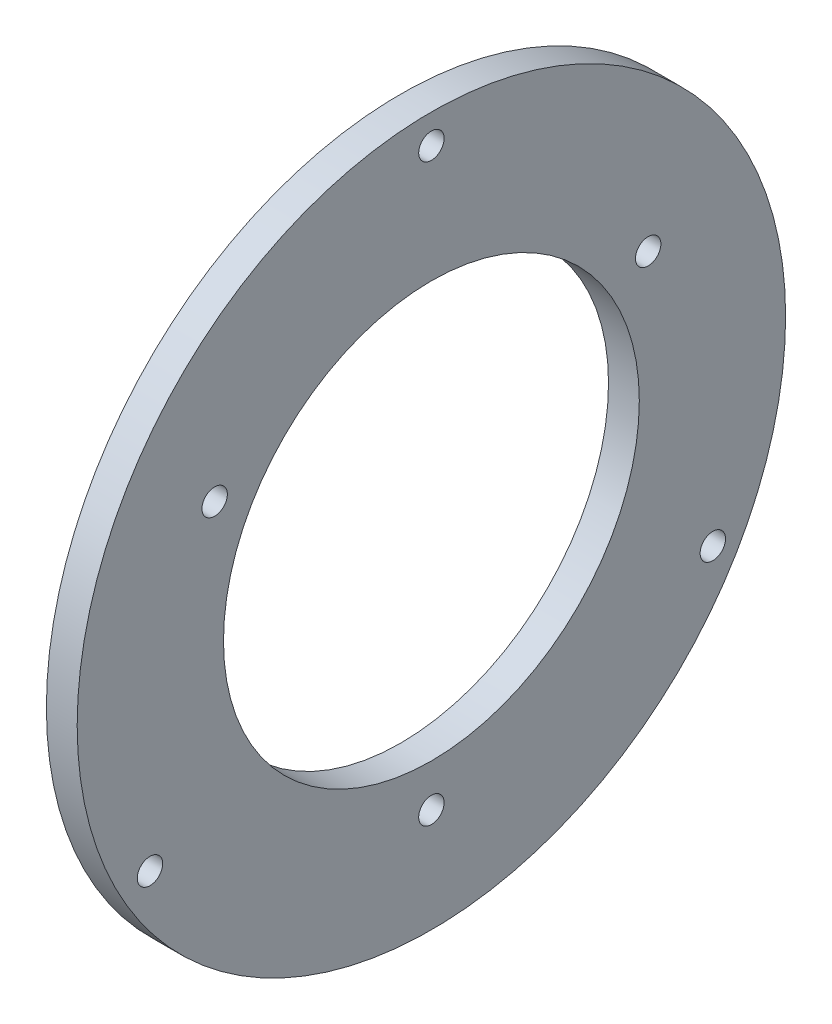
ISO-10303-21;
HEADER;
FILE_DESCRIPTION(('STEP AP214'),'2;1');
FILE_NAME('part.step','',(''),(''),'','','');
FILE_SCHEMA(('AUTOMOTIVE_DESIGN { 1 0 10303 214 1 1 1 1 }'));
ENDSEC;
DATA;
#1=APPLICATION_CONTEXT('core data for automotive mechanical design processes');
#2=APPLICATION_PROTOCOL_DEFINITION('international standard','automotive_design',2000,#1);
#3=PRODUCT_CONTEXT('',#1,'mechanical');
#4=PRODUCT('Part','Part','',(#3));
#5=PRODUCT_RELATED_PRODUCT_CATEGORY('part','',(#4));
#6=PRODUCT_DEFINITION_FORMATION('','',#4);
#7=PRODUCT_DEFINITION_CONTEXT('part definition',#1,'design');
#8=PRODUCT_DEFINITION('design','',#6,#7);
#9=PRODUCT_DEFINITION_SHAPE('','',#8);
#10=(LENGTH_UNIT() NAMED_UNIT(*) SI_UNIT(.MILLI.,.METRE.));
#11=(NAMED_UNIT(*) PLANE_ANGLE_UNIT() SI_UNIT($,.RADIAN.));
#12=(NAMED_UNIT(*) SI_UNIT($,.STERADIAN.) SOLID_ANGLE_UNIT());
#13=UNCERTAINTY_MEASURE_WITH_UNIT(LENGTH_MEASURE(1.E-05),#10,'distance_accuracy_value','');
#14=(GEOMETRIC_REPRESENTATION_CONTEXT(3) GLOBAL_UNCERTAINTY_ASSIGNED_CONTEXT((#13)) GLOBAL_UNIT_ASSIGNED_CONTEXT((#10,
#11,#12)) REPRESENTATION_CONTEXT('',''));
#15=CARTESIAN_POINT('',(0.,0.,0.));
#16=DIRECTION('',(0.,0.,1.));
#17=DIRECTION('',(1.,0.,0.));
#18=AXIS2_PLACEMENT_3D('',#15,#16,#17);
#19=CARTESIAN_POINT('',(131.7,46.,0.));
#20=DIRECTION('',(1.,0.,0.));
#21=DIRECTION('',(0.,0.,-1.));
#22=AXIS2_PLACEMENT_3D('',#19,#20,#21);
#23=PLANE('',#22);
#24=CARTESIAN_POINT('',(131.7,42.2,0.));
#25=DIRECTION('',(1.,0.,0.));
#26=DIRECTION('',(0.,0.,-1.));
#27=AXIS2_PLACEMENT_3D('',#24,#25,#26);
#28=CIRCLE('',#27,1.65);
#29=CARTESIAN_POINT('',(131.7,42.2,-1.65));
#30=VERTEX_POINT('',#29);
#31=EDGE_CURVE('E50',#30,#30,#28,.F.);
#32=ORIENTED_EDGE('',*,*,#31,.F.);
#33=EDGE_LOOP('',(#32));
#34=FACE_BOUND('',#33,.T.);
#35=CARTESIAN_POINT('',(131.7,16.25,-28.1458256229943));
#36=DIRECTION('',(1.,0.,0.));
#37=DIRECTION('',(0.,0.,-1.));
#38=AXIS2_PLACEMENT_3D('',#35,#36,#37);
#39=CIRCLE('',#38,1.65);
#40=CARTESIAN_POINT('',(131.7,16.25,-29.7958256229943));
#41=VERTEX_POINT('',#40);
#42=EDGE_CURVE('E53',#41,#41,#39,.F.);
#43=ORIENTED_EDGE('',*,*,#42,.F.);
#44=EDGE_LOOP('',(#43));
#45=FACE_BOUND('',#44,.T.);
#46=CARTESIAN_POINT('',(131.7,-21.1,36.5462720397033));
#47=DIRECTION('',(1.,0.,0.));
#48=DIRECTION('',(0.,0.,-1.));
#49=AXIS2_PLACEMENT_3D('',#46,#47,#48);
#50=CIRCLE('',#49,1.65);
#51=CARTESIAN_POINT('',(131.7,-21.1,34.8962720397033));
#52=VERTEX_POINT('',#51);
#53=EDGE_CURVE('E56',#52,#52,#50,.F.);
#54=ORIENTED_EDGE('',*,*,#53,.F.);
#55=EDGE_LOOP('',(#54));
#56=FACE_BOUND('',#55,.T.);
#57=CARTESIAN_POINT('',(131.7,-21.1,-36.5462720397033));
#58=DIRECTION('',(1.,0.,0.));
#59=DIRECTION('',(0.,0.,-1.));
#60=AXIS2_PLACEMENT_3D('',#57,#58,#59);
#61=CIRCLE('',#60,1.65);
#62=CARTESIAN_POINT('',(131.7,-21.1,-38.1962720397033));
#63=VERTEX_POINT('',#62);
#64=EDGE_CURVE('E59',#63,#63,#61,.F.);
#65=ORIENTED_EDGE('',*,*,#64,.F.);
#66=EDGE_LOOP('',(#65));
#67=FACE_BOUND('',#66,.T.);
#68=CARTESIAN_POINT('',(131.7,16.25,28.1458256229943));
#69=DIRECTION('',(1.,0.,0.));
#70=DIRECTION('',(0.,0.,-1.));
#71=AXIS2_PLACEMENT_3D('',#68,#69,#70);
#72=CIRCLE('',#71,1.65);
#73=CARTESIAN_POINT('',(131.7,16.25,26.4958256229943));
#74=VERTEX_POINT('',#73);
#75=EDGE_CURVE('E62',#74,#74,#72,.F.);
#76=ORIENTED_EDGE('',*,*,#75,.F.);
#77=EDGE_LOOP('',(#76));
#78=FACE_BOUND('',#77,.T.);
#79=CARTESIAN_POINT('',(131.7,-32.5,0.));
#80=DIRECTION('',(1.,0.,0.));
#81=DIRECTION('',(0.,0.,-1.));
#82=AXIS2_PLACEMENT_3D('',#79,#80,#81);
#83=CIRCLE('',#82,1.65);
#84=CARTESIAN_POINT('',(131.7,-32.5,-1.65));
#85=VERTEX_POINT('',#84);
#86=EDGE_CURVE('E65',#85,#85,#83,.F.);
#87=ORIENTED_EDGE('',*,*,#86,.F.);
#88=EDGE_LOOP('',(#87));
#89=FACE_BOUND('',#88,.T.);
#90=CARTESIAN_POINT('',(131.7,0.,0.));
#91=DIRECTION('',(-1.,0.,0.));
#92=DIRECTION('',(0.,0.,1.));
#93=AXIS2_PLACEMENT_3D('',#90,#91,#92);
#94=CIRCLE('',#93,27.);
#95=CARTESIAN_POINT('',(131.7,0.,27.));
#96=VERTEX_POINT('',#95);
#97=EDGE_CURVE('E10',#96,#96,#94,.T.);
#98=ORIENTED_EDGE('',*,*,#97,.F.);
#99=EDGE_LOOP('',(#98));
#100=FACE_BOUND('',#99,.T.);
#101=CARTESIAN_POINT('',(131.7,0.,0.));
#102=DIRECTION('',(-1.,0.,0.));
#103=DIRECTION('',(0.,0.,1.));
#104=AXIS2_PLACEMENT_3D('',#101,#102,#103);
#105=CIRCLE('',#104,46.);
#106=CARTESIAN_POINT('',(131.7,0.,46.));
#107=VERTEX_POINT('',#106);
#108=EDGE_CURVE('E45',#107,#107,#105,.T.);
#109=ORIENTED_EDGE('',*,*,#108,.T.);
#110=EDGE_LOOP('',(#109));
#111=FACE_BOUND('',#110,.T.);
#112=ADVANCED_FACE('F31',(#34,#45,#56,#67,#78,#89,#100,#111),#23,.F.);
#113=CARTESIAN_POINT('',(-110.,0.,0.));
#114=DIRECTION('',(-1.,0.,0.));
#115=DIRECTION('',(0.,0.,1.));
#116=AXIS2_PLACEMENT_3D('',#113,#114,#115);
#117=CYLINDRICAL_SURFACE('',#116,27.);
#118=CARTESIAN_POINT('',(135.7,0.,0.));
#119=DIRECTION('',(-1.,0.,0.));
#120=DIRECTION('',(0.,0.,1.));
#121=AXIS2_PLACEMENT_3D('',#118,#119,#120);
#122=CIRCLE('',#121,27.);
#123=CARTESIAN_POINT('',(135.7,0.,27.));
#124=VERTEX_POINT('',#123);
#125=EDGE_CURVE('E37',#124,#124,#122,.T.);
#126=ORIENTED_EDGE('',*,*,#125,.F.);
#127=EDGE_LOOP('',(#126));
#128=FACE_BOUND('',#127,.T.);
#129=ORIENTED_EDGE('',*,*,#97,.T.);
#130=EDGE_LOOP('',(#129));
#131=FACE_BOUND('',#130,.T.);
#132=ADVANCED_FACE('F94',(#128,#131),#117,.F.);
#133=CARTESIAN_POINT('',(135.7,27.,0.));
#134=DIRECTION('',(-1.,0.,0.));
#135=DIRECTION('',(0.,0.,1.));
#136=AXIS2_PLACEMENT_3D('',#133,#134,#135);
#137=PLANE('',#136);
#138=CARTESIAN_POINT('',(135.7,42.2,0.));
#139=DIRECTION('',(1.,0.,0.));
#140=DIRECTION('',(0.,0.,-1.));
#141=AXIS2_PLACEMENT_3D('',#138,#139,#140);
#142=CIRCLE('',#141,1.65);
#143=CARTESIAN_POINT('',(135.7,42.2,-1.65));
#144=VERTEX_POINT('',#143);
#145=EDGE_CURVE('E68',#144,#144,#142,.T.);
#146=ORIENTED_EDGE('',*,*,#145,.F.);
#147=EDGE_LOOP('',(#146));
#148=FACE_BOUND('',#147,.T.);
#149=CARTESIAN_POINT('',(135.7,16.25,-28.1458256229943));
#150=DIRECTION('',(1.,0.,0.));
#151=DIRECTION('',(0.,0.,-1.));
#152=AXIS2_PLACEMENT_3D('',#149,#150,#151);
#153=CIRCLE('',#152,1.65);
#154=CARTESIAN_POINT('',(135.7,16.25,-29.7958256229943));
#155=VERTEX_POINT('',#154);
#156=EDGE_CURVE('E79',#155,#155,#153,.T.);
#157=ORIENTED_EDGE('',*,*,#156,.F.);
#158=EDGE_LOOP('',(#157));
#159=FACE_BOUND('',#158,.T.);
#160=CARTESIAN_POINT('',(135.7,-21.1,36.5462720397033));
#161=DIRECTION('',(1.,0.,0.));
#162=DIRECTION('',(0.,0.,-1.));
#163=AXIS2_PLACEMENT_3D('',#160,#161,#162);
#164=CIRCLE('',#163,1.65);
#165=CARTESIAN_POINT('',(135.7,-21.1,34.8962720397033));
#166=VERTEX_POINT('',#165);
#167=EDGE_CURVE('E72',#166,#166,#164,.T.);
#168=ORIENTED_EDGE('',*,*,#167,.F.);
#169=EDGE_LOOP('',(#168));
#170=FACE_BOUND('',#169,.T.);
#171=CARTESIAN_POINT('',(135.7,-21.1,-36.5462720397033));
#172=DIRECTION('',(1.,0.,0.));
#173=DIRECTION('',(0.,0.,-1.));
#174=AXIS2_PLACEMENT_3D('',#171,#172,#173);
#175=CIRCLE('',#174,1.65);
#176=CARTESIAN_POINT('',(135.7,-21.1,-38.1962720397033));
#177=VERTEX_POINT('',#176);
#178=EDGE_CURVE('E69',#177,#177,#175,.T.);
#179=ORIENTED_EDGE('',*,*,#178,.F.);
#180=EDGE_LOOP('',(#179));
#181=FACE_BOUND('',#180,.T.);
#182=CARTESIAN_POINT('',(135.7,16.25,28.1458256229943));
#183=DIRECTION('',(1.,0.,0.));
#184=DIRECTION('',(0.,0.,-1.));
#185=AXIS2_PLACEMENT_3D('',#182,#183,#184);
#186=CIRCLE('',#185,1.65);
#187=CARTESIAN_POINT('',(135.7,16.25,26.4958256229943));
#188=VERTEX_POINT('',#187);
#189=EDGE_CURVE('E73',#188,#188,#186,.T.);
#190=ORIENTED_EDGE('',*,*,#189,.F.);
#191=EDGE_LOOP('',(#190));
#192=FACE_BOUND('',#191,.T.);
#193=CARTESIAN_POINT('',(135.7,-32.5,0.));
#194=DIRECTION('',(1.,0.,0.));
#195=DIRECTION('',(0.,0.,-1.));
#196=AXIS2_PLACEMENT_3D('',#193,#194,#195);
#197=CIRCLE('',#196,1.65);
#198=CARTESIAN_POINT('',(135.7,-32.5,-1.65));
#199=VERTEX_POINT('',#198);
#200=EDGE_CURVE('E76',#199,#199,#197,.T.);
#201=ORIENTED_EDGE('',*,*,#200,.F.);
#202=EDGE_LOOP('',(#201));
#203=FACE_BOUND('',#202,.T.);
#204=CARTESIAN_POINT('',(135.7,0.,0.));
#205=DIRECTION('',(-1.,0.,0.));
#206=DIRECTION('',(0.,0.,1.));
#207=AXIS2_PLACEMENT_3D('',#204,#205,#206);
#208=CIRCLE('',#207,46.);
#209=CARTESIAN_POINT('',(135.7,0.,46.));
#210=VERTEX_POINT('',#209);
#211=EDGE_CURVE('E41',#210,#210,#208,.T.);
#212=ORIENTED_EDGE('',*,*,#211,.F.);
#213=EDGE_LOOP('',(#212));
#214=FACE_BOUND('',#213,.T.);
#215=ORIENTED_EDGE('',*,*,#125,.T.);
#216=EDGE_LOOP('',(#215));
#217=FACE_BOUND('',#216,.T.);
#218=ADVANCED_FACE('F90',(#148,#159,#170,#181,#192,#203,#214,#217),#137,.F.);
#219=CARTESIAN_POINT('',(-110.,0.,0.));
#220=DIRECTION('',(-1.,0.,0.));
#221=DIRECTION('',(0.,0.,1.));
#222=AXIS2_PLACEMENT_3D('',#219,#220,#221);
#223=CYLINDRICAL_SURFACE('',#222,46.);
#224=ORIENTED_EDGE('',*,*,#108,.F.);
#225=EDGE_LOOP('',(#224));
#226=FACE_BOUND('',#225,.T.);
#227=ORIENTED_EDGE('',*,*,#211,.T.);
#228=EDGE_LOOP('',(#227));
#229=FACE_BOUND('',#228,.T.);
#230=ADVANCED_FACE('F93',(#226,#229),#223,.T.);
#231=CARTESIAN_POINT('',(135.7,-32.5,0.));
#232=DIRECTION('',(-1.,0.,0.));
#233=DIRECTION('',(0.,0.,1.));
#234=AXIS2_PLACEMENT_3D('',#231,#232,#233);
#235=CYLINDRICAL_SURFACE('',#234,1.65);
#236=ORIENTED_EDGE('',*,*,#200,.T.);
#237=EDGE_LOOP('',(#236));
#238=FACE_BOUND('',#237,.T.);
#239=ORIENTED_EDGE('',*,*,#86,.T.);
#240=EDGE_LOOP('',(#239));
#241=FACE_BOUND('',#240,.T.);
#242=ADVANCED_FACE('F109',(#238,#241),#235,.F.);
#243=CARTESIAN_POINT('',(135.7,16.25,28.1458256229943));
#244=DIRECTION('',(-1.,0.,0.));
#245=DIRECTION('',(0.,0.,1.));
#246=AXIS2_PLACEMENT_3D('',#243,#244,#245);
#247=CYLINDRICAL_SURFACE('',#246,1.65);
#248=ORIENTED_EDGE('',*,*,#189,.T.);
#249=EDGE_LOOP('',(#248));
#250=FACE_BOUND('',#249,.T.);
#251=ORIENTED_EDGE('',*,*,#75,.T.);
#252=EDGE_LOOP('',(#251));
#253=FACE_BOUND('',#252,.T.);
#254=ADVANCED_FACE('F115',(#250,#253),#247,.F.);
#255=CARTESIAN_POINT('',(135.7,-21.1,-36.5462720397033));
#256=DIRECTION('',(-1.,0.,0.));
#257=DIRECTION('',(0.,0.,1.));
#258=AXIS2_PLACEMENT_3D('',#255,#256,#257);
#259=CYLINDRICAL_SURFACE('',#258,1.65);
#260=ORIENTED_EDGE('',*,*,#178,.T.);
#261=EDGE_LOOP('',(#260));
#262=FACE_BOUND('',#261,.T.);
#263=ORIENTED_EDGE('',*,*,#64,.T.);
#264=EDGE_LOOP('',(#263));
#265=FACE_BOUND('',#264,.T.);
#266=ADVANCED_FACE('F142',(#262,#265),#259,.F.);
#267=CARTESIAN_POINT('',(135.7,-21.1,36.5462720397033));
#268=DIRECTION('',(-1.,0.,0.));
#269=DIRECTION('',(0.,0.,1.));
#270=AXIS2_PLACEMENT_3D('',#267,#268,#269);
#271=CYLINDRICAL_SURFACE('',#270,1.65);
#272=ORIENTED_EDGE('',*,*,#167,.T.);
#273=EDGE_LOOP('',(#272));
#274=FACE_BOUND('',#273,.T.);
#275=ORIENTED_EDGE('',*,*,#53,.T.);
#276=EDGE_LOOP('',(#275));
#277=FACE_BOUND('',#276,.T.);
#278=ADVANCED_FACE('F148',(#274,#277),#271,.F.);
#279=CARTESIAN_POINT('',(135.7,16.25,-28.1458256229943));
#280=DIRECTION('',(-1.,0.,0.));
#281=DIRECTION('',(0.,0.,1.));
#282=AXIS2_PLACEMENT_3D('',#279,#280,#281);
#283=CYLINDRICAL_SURFACE('',#282,1.65);
#284=ORIENTED_EDGE('',*,*,#156,.T.);
#285=EDGE_LOOP('',(#284));
#286=FACE_BOUND('',#285,.T.);
#287=ORIENTED_EDGE('',*,*,#42,.T.);
#288=EDGE_LOOP('',(#287));
#289=FACE_BOUND('',#288,.T.);
#290=ADVANCED_FACE('F151',(#286,#289),#283,.F.);
#291=CARTESIAN_POINT('',(135.7,42.2,0.));
#292=DIRECTION('',(-1.,0.,0.));
#293=DIRECTION('',(0.,0.,1.));
#294=AXIS2_PLACEMENT_3D('',#291,#292,#293);
#295=CYLINDRICAL_SURFACE('',#294,1.65);
#296=ORIENTED_EDGE('',*,*,#145,.T.);
#297=EDGE_LOOP('',(#296));
#298=FACE_BOUND('',#297,.T.);
#299=ORIENTED_EDGE('',*,*,#31,.T.);
#300=EDGE_LOOP('',(#299));
#301=FACE_BOUND('',#300,.T.);
#302=ADVANCED_FACE('F87',(#298,#301),#295,.F.);
#303=CLOSED_SHELL('',(#112,#132,#218,#230,#242,#254,#266,#278,#290,#302));
#304=MANIFOLD_SOLID_BREP('B2',#303);
#305=ADVANCED_BREP_SHAPE_REPRESENTATION('',(#18,#304),#14);
#306=SHAPE_DEFINITION_REPRESENTATION(#9,#305);
ENDSEC;
END-ISO-10303-21;
